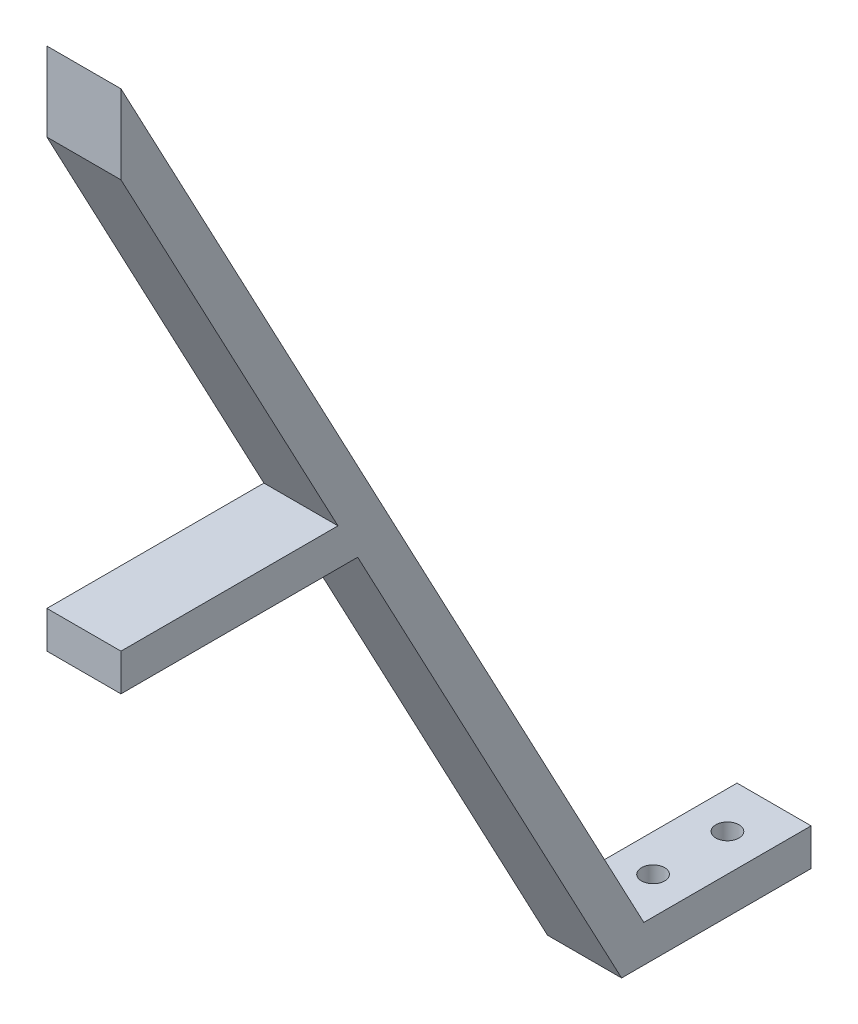
ISO-10303-21;
HEADER;
FILE_DESCRIPTION(('STEP AP214'),'2;1');
FILE_NAME('part.step','',(''),(''),'','','');
FILE_SCHEMA(('AUTOMOTIVE_DESIGN { 1 0 10303 214 1 1 1 1 }'));
ENDSEC;
DATA;
#1=APPLICATION_CONTEXT('core data for automotive mechanical design processes');
#2=APPLICATION_PROTOCOL_DEFINITION('international standard','automotive_design',2000,#1);
#3=PRODUCT_CONTEXT('',#1,'mechanical');
#4=PRODUCT('Part','Part','',(#3));
#5=PRODUCT_RELATED_PRODUCT_CATEGORY('part','',(#4));
#6=PRODUCT_DEFINITION_FORMATION('','',#4);
#7=PRODUCT_DEFINITION_CONTEXT('part definition',#1,'design');
#8=PRODUCT_DEFINITION('design','',#6,#7);
#9=PRODUCT_DEFINITION_SHAPE('','',#8);
#10=(LENGTH_UNIT() NAMED_UNIT(*) SI_UNIT(.MILLI.,.METRE.));
#11=(NAMED_UNIT(*) PLANE_ANGLE_UNIT() SI_UNIT($,.RADIAN.));
#12=(NAMED_UNIT(*) SI_UNIT($,.STERADIAN.) SOLID_ANGLE_UNIT());
#13=UNCERTAINTY_MEASURE_WITH_UNIT(LENGTH_MEASURE(1.E-05),#10,'distance_accuracy_value','');
#14=(GEOMETRIC_REPRESENTATION_CONTEXT(3) GLOBAL_UNCERTAINTY_ASSIGNED_CONTEXT((#13)) GLOBAL_UNIT_ASSIGNED_CONTEXT((#10,
#11,#12)) REPRESENTATION_CONTEXT('',''));
#15=CARTESIAN_POINT('',(0.,0.,0.));
#16=DIRECTION('',(0.,0.,1.));
#17=DIRECTION('',(1.,0.,0.));
#18=AXIS2_PLACEMENT_3D('',#15,#16,#17);
#19=CARTESIAN_POINT('',(50.8,499.630355499658,-1.62040693367633));
#20=DIRECTION('',(0.,0.,-1.));
#21=DIRECTION('',(0.,1.,0.));
#22=AXIS2_PLACEMENT_3D('',#19,#20,#21);
#23=PLANE('',#22);
#24=DIRECTION('',(0.,-1.,0.));
#25=VECTOR('',#24,1.);
#26=CARTESIAN_POINT('',(0.,499.630355499658,-1.62040693367633));
#27=LINE('',#26,#25);
#28=CARTESIAN_POINT('',(0.,499.630355499658,-1.62040693367633));
#29=VERTEX_POINT('',#28);
#30=CARTESIAN_POINT('',(0.,445.526972007644,-1.62040693367634));
#31=VERTEX_POINT('',#30);
#32=EDGE_CURVE('E141',#29,#31,#27,.T.);
#33=ORIENTED_EDGE('',*,*,#32,.T.);
#34=DIRECTION('',(-1.,0.,0.));
#35=VECTOR('',#34,1.);
#36=CARTESIAN_POINT('',(50.8,445.526972007644,-1.62040693367634));
#37=LINE('',#36,#35);
#38=CARTESIAN_POINT('',(50.8,445.526972007644,-1.62040693367634));
#39=VERTEX_POINT('',#38);
#40=EDGE_CURVE('E11',#39,#31,#37,.T.);
#41=ORIENTED_EDGE('',*,*,#40,.F.);
#42=DIRECTION('',(0.,-1.,0.));
#43=VECTOR('',#42,1.);
#44=CARTESIAN_POINT('',(50.8,499.630355499658,-1.62040693367633));
#45=LINE('',#44,#43);
#46=CARTESIAN_POINT('',(50.8,499.630355499658,-1.62040693367633));
#47=VERTEX_POINT('',#46);
#48=EDGE_CURVE('E160',#47,#39,#45,.T.);
#49=ORIENTED_EDGE('',*,*,#48,.F.);
#50=DIRECTION('',(-1.,0.,0.));
#51=VECTOR('',#50,1.);
#52=CARTESIAN_POINT('',(50.8,499.630355499658,-1.62040693367633));
#53=LINE('',#52,#51);
#54=EDGE_CURVE('E137',#47,#29,#53,.T.);
#55=ORIENTED_EDGE('',*,*,#54,.T.);
#56=EDGE_LOOP('',(#33,#41,#49,#55));
#57=FACE_BOUND('',#56,.T.);
#58=ADVANCED_FACE('F33',(#57),#23,.F.);
#59=CARTESIAN_POINT('',(50.8,445.526972007644,-1.62040693367634));
#60=DIRECTION('',(0.,0.469471562785886,-0.88294759285893));
#61=DIRECTION('',(0.,0.88294759285893,0.469471562785886));
#62=AXIS2_PLACEMENT_3D('',#59,#60,#61);
#63=PLANE('',#62);
#64=DIRECTION('',(0.,-0.882947592858929,-0.469471562785886));
#65=VECTOR('',#64,1.);
#66=CARTESIAN_POINT('',(0.,445.526972007644,-1.62040693367634));
#67=LINE('',#66,#65);
#68=CARTESIAN_POINT('',(0.,165.526972007644,-150.499047798888));
#69=VERTEX_POINT('',#68);
#70=EDGE_CURVE('E144',#31,#69,#67,.T.);
#71=ORIENTED_EDGE('',*,*,#70,.T.);
#72=DIRECTION('',(-1.,0.,0.));
#73=VECTOR('',#72,1.);
#74=CARTESIAN_POINT('',(50.8,165.526972007644,-150.499047798888));
#75=LINE('',#74,#73);
#76=CARTESIAN_POINT('',(50.8,165.526972007644,-150.499047798888));
#77=VERTEX_POINT('',#76);
#78=EDGE_CURVE('E41',#77,#69,#75,.T.);
#79=ORIENTED_EDGE('',*,*,#78,.F.);
#80=DIRECTION('',(0.,-0.882947592858929,-0.469471562785886));
#81=VECTOR('',#80,1.);
#82=CARTESIAN_POINT('',(50.8,445.526972007644,-1.62040693367634));
#83=LINE('',#82,#81);
#84=EDGE_CURVE('E98',#39,#77,#83,.T.);
#85=ORIENTED_EDGE('',*,*,#84,.F.);
#86=ORIENTED_EDGE('',*,*,#40,.T.);
#87=EDGE_LOOP('',(#71,#79,#85,#86));
#88=FACE_BOUND('',#87,.T.);
#89=ADVANCED_FACE('F254',(#88),#63,.F.);
#90=CARTESIAN_POINT('',(50.8,165.526972007644,-1.6204069336763));
#91=DIRECTION('',(0.,-1.,0.));
#92=DIRECTION('',(0.,0.,-1.));
#93=AXIS2_PLACEMENT_3D('',#90,#91,#92);
#94=PLANE('',#93);
#95=DIRECTION('',(0.,0.,1.));
#96=VECTOR('',#95,1.);
#97=CARTESIAN_POINT('',(0.,165.526972007644,-1.6204069336763));
#98=LINE('',#97,#96);
#99=CARTESIAN_POINT('',(0.,165.526972007644,-1.6204069336763));
#100=VERTEX_POINT('',#99);
#101=EDGE_CURVE('E147',#69,#100,#98,.T.);
#102=ORIENTED_EDGE('',*,*,#101,.T.);
#103=DIRECTION('',(-1.,0.,0.));
#104=VECTOR('',#103,1.);
#105=CARTESIAN_POINT('',(50.8,165.526972007644,-1.6204069336763));
#106=LINE('',#105,#104);
#107=CARTESIAN_POINT('',(50.8,165.526972007644,-1.6204069336763));
#108=VERTEX_POINT('',#107);
#109=EDGE_CURVE('E173',#108,#100,#106,.T.);
#110=ORIENTED_EDGE('',*,*,#109,.F.);
#111=DIRECTION('',(0.,0.,1.));
#112=VECTOR('',#111,1.);
#113=CARTESIAN_POINT('',(50.8,165.526972007644,-1.6204069336763));
#114=LINE('',#113,#112);
#115=EDGE_CURVE('E181',#77,#108,#114,.T.);
#116=ORIENTED_EDGE('',*,*,#115,.F.);
#117=ORIENTED_EDGE('',*,*,#78,.T.);
#118=EDGE_LOOP('',(#102,#110,#116,#117));
#119=FACE_BOUND('',#118,.T.);
#120=ADVANCED_FACE('F179',(#119),#94,.F.);
#121=CARTESIAN_POINT('',(50.8,140.126972007644,-1.6204069336763));
#122=DIRECTION('',(0.,0.,-1.));
#123=DIRECTION('',(0.,1.,0.));
#124=AXIS2_PLACEMENT_3D('',#121,#122,#123);
#125=PLANE('',#124);
#126=DIRECTION('',(0.,-1.,0.));
#127=VECTOR('',#126,1.);
#128=CARTESIAN_POINT('',(0.,140.126972007644,-1.6204069336763));
#129=LINE('',#128,#127);
#130=CARTESIAN_POINT('',(0.,140.126972007644,-1.6204069336763));
#131=VERTEX_POINT('',#130);
#132=EDGE_CURVE('E149',#100,#131,#129,.T.);
#133=ORIENTED_EDGE('',*,*,#132,.T.);
#134=DIRECTION('',(-1.,0.,0.));
#135=VECTOR('',#134,1.);
#136=CARTESIAN_POINT('',(50.8,140.126972007644,-1.6204069336763));
#137=LINE('',#136,#135);
#138=CARTESIAN_POINT('',(50.8,140.126972007644,-1.6204069336763));
#139=VERTEX_POINT('',#138);
#140=EDGE_CURVE('E170',#139,#131,#137,.T.);
#141=ORIENTED_EDGE('',*,*,#140,.F.);
#142=DIRECTION('',(0.,-1.,0.));
#143=VECTOR('',#142,1.);
#144=CARTESIAN_POINT('',(50.8,140.126972007644,-1.6204069336763));
#145=LINE('',#144,#143);
#146=EDGE_CURVE('E199',#108,#139,#145,.T.);
#147=ORIENTED_EDGE('',*,*,#146,.F.);
#148=ORIENTED_EDGE('',*,*,#109,.T.);
#149=EDGE_LOOP('',(#133,#141,#147,#148));
#150=FACE_BOUND('',#149,.T.);
#151=ADVANCED_FACE('F190',(#150),#125,.F.);
#152=CARTESIAN_POINT('',(50.8,140.126972007644,-1.6204069336763));
#153=DIRECTION('',(0.,1.,0.));
#154=DIRECTION('',(0.,0.,1.));
#155=AXIS2_PLACEMENT_3D('',#152,#153,#154);
#156=PLANE('',#155);
#157=DIRECTION('',(0.,0.,-1.));
#158=VECTOR('',#157,1.);
#159=CARTESIAN_POINT('',(0.,140.126972007644,-1.6204069336763));
#160=LINE('',#159,#158);
#161=CARTESIAN_POINT('',(0.,140.126972007644,-164.00446736309));
#162=VERTEX_POINT('',#161);
#163=EDGE_CURVE('E151',#131,#162,#160,.T.);
#164=ORIENTED_EDGE('',*,*,#163,.T.);
#165=DIRECTION('',(-1.,0.,0.));
#166=VECTOR('',#165,1.);
#167=CARTESIAN_POINT('',(50.8,140.126972007644,-164.00446736309));
#168=LINE('',#167,#166);
#169=CARTESIAN_POINT('',(50.8,140.126972007644,-164.00446736309));
#170=VERTEX_POINT('',#169);
#171=EDGE_CURVE('E167',#170,#162,#168,.T.);
#172=ORIENTED_EDGE('',*,*,#171,.F.);
#173=DIRECTION('',(0.,0.,-1.));
#174=VECTOR('',#173,1.);
#175=CARTESIAN_POINT('',(50.8,140.126972007644,-1.6204069336763));
#176=LINE('',#175,#174);
#177=EDGE_CURVE('E196',#139,#170,#176,.T.);
#178=ORIENTED_EDGE('',*,*,#177,.F.);
#179=ORIENTED_EDGE('',*,*,#140,.T.);
#180=EDGE_LOOP('',(#164,#172,#178,#179));
#181=FACE_BOUND('',#180,.T.);
#182=ADVANCED_FACE('F194',(#181),#156,.F.);
#183=CARTESIAN_POINT('',(50.8,140.126972007644,-164.00446736309));
#184=DIRECTION('',(0.,0.469471562785885,-0.88294759285893));
#185=DIRECTION('',(0.,0.88294759285893,0.469471562785885));
#186=AXIS2_PLACEMENT_3D('',#183,#184,#185);
#187=PLANE('',#186);
#188=DIRECTION('',(0.,-0.88294759285893,-0.469471562785885));
#189=VECTOR('',#188,1.);
#190=CARTESIAN_POINT('',(0.,140.126972007644,-164.00446736309));
#191=LINE('',#190,#189);
#192=CARTESIAN_POINT('',(0.,-200.369644500342,-345.049729809205));
#193=VERTEX_POINT('',#192);
#194=EDGE_CURVE('E153',#162,#193,#191,.T.);
#195=ORIENTED_EDGE('',*,*,#194,.T.);
#196=DIRECTION('',(-1.,0.,0.));
#197=VECTOR('',#196,1.);
#198=CARTESIAN_POINT('',(50.8,-200.369644500342,-345.049729809205));
#199=LINE('',#198,#197);
#200=CARTESIAN_POINT('',(50.8,-200.369644500342,-345.049729809205));
#201=VERTEX_POINT('',#200);
#202=EDGE_CURVE('E164',#201,#193,#199,.T.);
#203=ORIENTED_EDGE('',*,*,#202,.F.);
#204=DIRECTION('',(0.,-0.88294759285893,-0.469471562785885));
#205=VECTOR('',#204,1.);
#206=CARTESIAN_POINT('',(50.8,140.126972007644,-164.00446736309));
#207=LINE('',#206,#205);
#208=EDGE_CURVE('E198',#170,#201,#207,.T.);
#209=ORIENTED_EDGE('',*,*,#208,.F.);
#210=ORIENTED_EDGE('',*,*,#171,.T.);
#211=EDGE_LOOP('',(#195,#203,#209,#210));
#212=FACE_BOUND('',#211,.T.);
#213=ADVANCED_FACE('F237',(#212),#187,.F.);
#214=CARTESIAN_POINT('',(50.8,-200.369644500342,-345.049729809205));
#215=DIRECTION('',(0.,1.,0.));
#216=DIRECTION('',(0.,0.,1.));
#217=AXIS2_PLACEMENT_3D('',#214,#215,#216);
#218=PLANE('',#217);
#219=CARTESIAN_POINT('',(25.4,-200.369644500342,-392.049729809205));
#220=DIRECTION('',(0.,1.,0.));
#221=DIRECTION('',(0.,0.,1.));
#222=AXIS2_PLACEMENT_3D('',#219,#220,#221);
#223=CIRCLE('',#222,7.9375);
#224=CARTESIAN_POINT('',(25.4,-200.369644500342,-384.112229809205));
#225=VERTEX_POINT('',#224);
#226=EDGE_CURVE('E212',#225,#225,#223,.T.);
#227=ORIENTED_EDGE('',*,*,#226,.T.);
#228=EDGE_LOOP('',(#227));
#229=FACE_BOUND('',#228,.T.);
#230=CARTESIAN_POINT('',(25.4,-200.369644500342,-443.049729809205));
#231=DIRECTION('',(0.,1.,0.));
#232=DIRECTION('',(0.,0.,1.));
#233=AXIS2_PLACEMENT_3D('',#230,#231,#232);
#234=CIRCLE('',#233,7.9375);
#235=CARTESIAN_POINT('',(25.4,-200.369644500342,-435.112229809205));
#236=VERTEX_POINT('',#235);
#237=EDGE_CURVE('E145',#236,#236,#234,.T.);
#238=ORIENTED_EDGE('',*,*,#237,.T.);
#239=EDGE_LOOP('',(#238));
#240=FACE_BOUND('',#239,.T.);
#241=DIRECTION('',(0.,0.,-1.));
#242=VECTOR('',#241,1.);
#243=CARTESIAN_POINT('',(0.,-200.369644500342,-345.049729809205));
#244=LINE('',#243,#242);
#245=CARTESIAN_POINT('',(0.,-200.369644500342,-475.049729809205));
#246=VERTEX_POINT('',#245);
#247=EDGE_CURVE('E155',#193,#246,#244,.T.);
#248=ORIENTED_EDGE('',*,*,#247,.T.);
#249=DIRECTION('',(-1.,0.,0.));
#250=VECTOR('',#249,1.);
#251=CARTESIAN_POINT('',(50.8,-200.369644500342,-475.049729809205));
#252=LINE('',#251,#250);
#253=CARTESIAN_POINT('',(50.8,-200.369644500342,-475.049729809205));
#254=VERTEX_POINT('',#253);
#255=EDGE_CURVE('E132',#254,#246,#252,.T.);
#256=ORIENTED_EDGE('',*,*,#255,.F.);
#257=DIRECTION('',(0.,0.,-1.));
#258=VECTOR('',#257,1.);
#259=CARTESIAN_POINT('',(50.8,-200.369644500342,-345.049729809205));
#260=LINE('',#259,#258);
#261=EDGE_CURVE('E123',#201,#254,#260,.T.);
#262=ORIENTED_EDGE('',*,*,#261,.F.);
#263=ORIENTED_EDGE('',*,*,#202,.T.);
#264=EDGE_LOOP('',(#248,#256,#262,#263));
#265=FACE_BOUND('',#264,.T.);
#266=ADVANCED_FACE('F234',(#229,#240,#265),#218,.F.);
#267=CARTESIAN_POINT('',(50.8,-200.369644500342,-475.049729809205));
#268=DIRECTION('',(0.,0.,1.));
#269=DIRECTION('',(1.,0.,0.));
#270=AXIS2_PLACEMENT_3D('',#267,#268,#269);
#271=PLANE('',#270);
#272=DIRECTION('',(0.,1.,0.));
#273=VECTOR('',#272,1.);
#274=CARTESIAN_POINT('',(0.,-200.369644500342,-475.049729809205));
#275=LINE('',#274,#273);
#276=CARTESIAN_POINT('',(0.,-174.969644500342,-475.049729809205));
#277=VERTEX_POINT('',#276);
#278=EDGE_CURVE('E131',#246,#277,#275,.T.);
#279=ORIENTED_EDGE('',*,*,#278,.T.);
#280=DIRECTION('',(-1.,0.,0.));
#281=VECTOR('',#280,1.);
#282=CARTESIAN_POINT('',(50.8,-174.969644500342,-475.049729809205));
#283=LINE('',#282,#281);
#284=CARTESIAN_POINT('',(50.8,-174.969644500342,-475.049729809205));
#285=VERTEX_POINT('',#284);
#286=EDGE_CURVE('E128',#285,#277,#283,.T.);
#287=ORIENTED_EDGE('',*,*,#286,.F.);
#288=DIRECTION('',(0.,1.,0.));
#289=VECTOR('',#288,1.);
#290=CARTESIAN_POINT('',(50.8,-200.369644500342,-475.049729809205));
#291=LINE('',#290,#289);
#292=EDGE_CURVE('E117',#254,#285,#291,.T.);
#293=ORIENTED_EDGE('',*,*,#292,.F.);
#294=ORIENTED_EDGE('',*,*,#255,.T.);
#295=EDGE_LOOP('',(#279,#287,#293,#294));
#296=FACE_BOUND('',#295,.T.);
#297=ADVANCED_FACE('F129',(#296),#271,.F.);
#298=CARTESIAN_POINT('',(50.8,-174.969644500342,-475.049729809205));
#299=DIRECTION('',(0.,-1.,0.));
#300=DIRECTION('',(0.,0.,-1.));
#301=AXIS2_PLACEMENT_3D('',#298,#299,#300);
#302=PLANE('',#301);
#303=CARTESIAN_POINT('',(25.4,-174.969644500342,-392.049729809205));
#304=DIRECTION('',(0.,1.,0.));
#305=DIRECTION('',(0.,0.,1.));
#306=AXIS2_PLACEMENT_3D('',#303,#304,#305);
#307=CIRCLE('',#306,7.9375);
#308=CARTESIAN_POINT('',(25.4,-174.969644500342,-384.112229809205));
#309=VERTEX_POINT('',#308);
#310=EDGE_CURVE('E215',#309,#309,#307,.T.);
#311=ORIENTED_EDGE('',*,*,#310,.F.);
#312=EDGE_LOOP('',(#311));
#313=FACE_BOUND('',#312,.T.);
#314=CARTESIAN_POINT('',(25.4,-174.969644500342,-443.049729809205));
#315=DIRECTION('',(0.,1.,0.));
#316=DIRECTION('',(0.,0.,1.));
#317=AXIS2_PLACEMENT_3D('',#314,#315,#316);
#318=CIRCLE('',#317,7.9375);
#319=CARTESIAN_POINT('',(25.4,-174.969644500342,-435.112229809205));
#320=VERTEX_POINT('',#319);
#321=EDGE_CURVE('E209',#320,#320,#318,.T.);
#322=ORIENTED_EDGE('',*,*,#321,.F.);
#323=EDGE_LOOP('',(#322));
#324=FACE_BOUND('',#323,.T.);
#325=DIRECTION('',(0.,0.,1.));
#326=VECTOR('',#325,1.);
#327=CARTESIAN_POINT('',(0.,-174.969644500342,-475.049729809205));
#328=LINE('',#327,#326);
#329=CARTESIAN_POINT('',(0.,-174.969644500342,-360.311589532505));
#330=VERTEX_POINT('',#329);
#331=EDGE_CURVE('E84',#277,#330,#328,.T.);
#332=ORIENTED_EDGE('',*,*,#331,.T.);
#333=DIRECTION('',(-1.,0.,0.));
#334=VECTOR('',#333,1.);
#335=CARTESIAN_POINT('',(50.8,-174.969644500342,-360.311589532505));
#336=LINE('',#335,#334);
#337=CARTESIAN_POINT('',(50.8,-174.969644500342,-360.311589532505));
#338=VERTEX_POINT('',#337);
#339=EDGE_CURVE('E133',#338,#330,#336,.T.);
#340=ORIENTED_EDGE('',*,*,#339,.F.);
#341=DIRECTION('',(0.,0.,1.));
#342=VECTOR('',#341,1.);
#343=CARTESIAN_POINT('',(50.8,-174.969644500342,-475.049729809205));
#344=LINE('',#343,#342);
#345=EDGE_CURVE('E121',#285,#338,#344,.T.);
#346=ORIENTED_EDGE('',*,*,#345,.F.);
#347=ORIENTED_EDGE('',*,*,#286,.T.);
#348=EDGE_LOOP('',(#332,#340,#346,#347));
#349=FACE_BOUND('',#348,.T.);
#350=ADVANCED_FACE('F135',(#313,#324,#349),#302,.F.);
#351=CARTESIAN_POINT('',(50.8,499.630355499658,-1.62040693367633));
#352=DIRECTION('',(0.,-0.469471562785886,0.88294759285893));
#353=DIRECTION('',(0.,-0.88294759285893,-0.469471562785886));
#354=AXIS2_PLACEMENT_3D('',#351,#352,#353);
#355=PLANE('',#354);
#356=DIRECTION('',(0.,0.88294759285893,0.469471562785886));
#357=VECTOR('',#356,1.);
#358=CARTESIAN_POINT('',(0.,499.630355499658,-1.62040693367633));
#359=LINE('',#358,#357);
#360=EDGE_CURVE('E90',#330,#29,#359,.T.);
#361=ORIENTED_EDGE('',*,*,#360,.T.);
#362=ORIENTED_EDGE('',*,*,#54,.F.);
#363=DIRECTION('',(0.,0.88294759285893,0.469471562785886));
#364=VECTOR('',#363,1.);
#365=CARTESIAN_POINT('',(50.8,499.630355499658,-1.62040693367633));
#366=LINE('',#365,#364);
#367=EDGE_CURVE('E49',#338,#47,#366,.T.);
#368=ORIENTED_EDGE('',*,*,#367,.F.);
#369=ORIENTED_EDGE('',*,*,#339,.T.);
#370=EDGE_LOOP('',(#361,#362,#368,#369));
#371=FACE_BOUND('',#370,.T.);
#372=ADVANCED_FACE('F224',(#371),#355,.F.);
#373=CARTESIAN_POINT('',(50.8,0.,0.));
#374=DIRECTION('',(1.,0.,0.));
#375=DIRECTION('',(0.,0.,-1.));
#376=AXIS2_PLACEMENT_3D('',#373,#374,#375);
#377=PLANE('',#376);
#378=ORIENTED_EDGE('',*,*,#48,.T.);
#379=ORIENTED_EDGE('',*,*,#84,.T.);
#380=ORIENTED_EDGE('',*,*,#115,.T.);
#381=ORIENTED_EDGE('',*,*,#146,.T.);
#382=ORIENTED_EDGE('',*,*,#177,.T.);
#383=ORIENTED_EDGE('',*,*,#208,.T.);
#384=ORIENTED_EDGE('',*,*,#261,.T.);
#385=ORIENTED_EDGE('',*,*,#292,.T.);
#386=ORIENTED_EDGE('',*,*,#345,.T.);
#387=ORIENTED_EDGE('',*,*,#367,.T.);
#388=EDGE_LOOP('',(#378,#379,#380,#381,#382,#383,#384,#385,#386,#387));
#389=FACE_BOUND('',#388,.T.);
#390=ADVANCED_FACE('F119',(#389),#377,.T.);
#391=CARTESIAN_POINT('',(0.,0.,0.));
#392=DIRECTION('',(1.,0.,0.));
#393=DIRECTION('',(0.,0.,-1.));
#394=AXIS2_PLACEMENT_3D('',#391,#392,#393);
#395=PLANE('',#394);
#396=ORIENTED_EDGE('',*,*,#32,.F.);
#397=ORIENTED_EDGE('',*,*,#360,.F.);
#398=ORIENTED_EDGE('',*,*,#331,.F.);
#399=ORIENTED_EDGE('',*,*,#278,.F.);
#400=ORIENTED_EDGE('',*,*,#247,.F.);
#401=ORIENTED_EDGE('',*,*,#194,.F.);
#402=ORIENTED_EDGE('',*,*,#163,.F.);
#403=ORIENTED_EDGE('',*,*,#132,.F.);
#404=ORIENTED_EDGE('',*,*,#101,.F.);
#405=ORIENTED_EDGE('',*,*,#70,.F.);
#406=EDGE_LOOP('',(#396,#397,#398,#399,#400,#401,#402,#403,#404,#405));
#407=FACE_BOUND('',#406,.T.);
#408=ADVANCED_FACE('F185',(#407),#395,.F.);
#409=CARTESIAN_POINT('',(25.4,-225.769644500342,-443.049729809205));
#410=DIRECTION('',(0.,1.,0.));
#411=DIRECTION('',(0.,0.,1.));
#412=AXIS2_PLACEMENT_3D('',#409,#410,#411);
#413=CYLINDRICAL_SURFACE('',#412,7.9375);
#414=ORIENTED_EDGE('',*,*,#321,.T.);
#415=EDGE_LOOP('',(#414));
#416=FACE_BOUND('',#415,.T.);
#417=ORIENTED_EDGE('',*,*,#237,.F.);
#418=EDGE_LOOP('',(#417));
#419=FACE_BOUND('',#418,.T.);
#420=ADVANCED_FACE('F228',(#416,#419),#413,.F.);
#421=CARTESIAN_POINT('',(25.4,-225.769644500342,-392.049729809205));
#422=DIRECTION('',(0.,1.,0.));
#423=DIRECTION('',(0.,0.,1.));
#424=AXIS2_PLACEMENT_3D('',#421,#422,#423);
#425=CYLINDRICAL_SURFACE('',#424,7.9375);
#426=ORIENTED_EDGE('',*,*,#310,.T.);
#427=EDGE_LOOP('',(#426));
#428=FACE_BOUND('',#427,.T.);
#429=ORIENTED_EDGE('',*,*,#226,.F.);
#430=EDGE_LOOP('',(#429));
#431=FACE_BOUND('',#430,.T.);
#432=ADVANCED_FACE('F219',(#428,#431),#425,.F.);
#433=CLOSED_SHELL('',(#58,#89,#120,#151,#182,#213,#266,#297,#350,#372,#390,#408,#420,#432));
#434=MANIFOLD_SOLID_BREP('B2',#433);
#435=ADVANCED_BREP_SHAPE_REPRESENTATION('',(#18,#434),#14);
#436=SHAPE_DEFINITION_REPRESENTATION(#9,#435);
ENDSEC;
END-ISO-10303-21;
